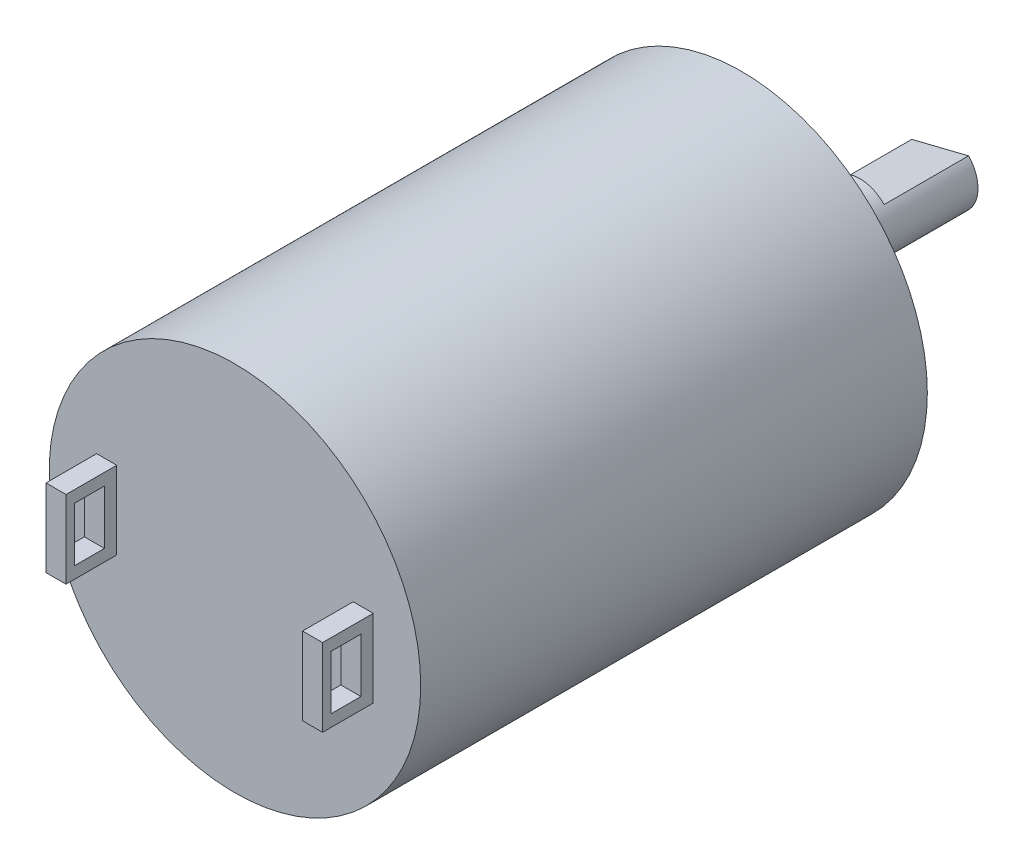
ISO-10303-21;
HEADER;
FILE_DESCRIPTION(('STEP AP214'),'2;1');
FILE_NAME('part.step','',(''),(''),'','','');
FILE_SCHEMA(('AUTOMOTIVE_DESIGN { 1 0 10303 214 1 1 1 1 }'));
ENDSEC;
DATA;
#1=APPLICATION_CONTEXT('core data for automotive mechanical design processes');
#2=APPLICATION_PROTOCOL_DEFINITION('international standard','automotive_design',2000,#1);
#3=PRODUCT_CONTEXT('',#1,'mechanical');
#4=PRODUCT('Part','Part','',(#3));
#5=PRODUCT_RELATED_PRODUCT_CATEGORY('part','',(#4));
#6=PRODUCT_DEFINITION_FORMATION('','',#4);
#7=PRODUCT_DEFINITION_CONTEXT('part definition',#1,'design');
#8=PRODUCT_DEFINITION('design','',#6,#7);
#9=PRODUCT_DEFINITION_SHAPE('','',#8);
#10=(LENGTH_UNIT() NAMED_UNIT(*) SI_UNIT(.MILLI.,.METRE.));
#11=(NAMED_UNIT(*) PLANE_ANGLE_UNIT() SI_UNIT($,.RADIAN.));
#12=(NAMED_UNIT(*) SI_UNIT($,.STERADIAN.) SOLID_ANGLE_UNIT());
#13=UNCERTAINTY_MEASURE_WITH_UNIT(LENGTH_MEASURE(1.E-05),#10,'distance_accuracy_value','');
#14=(GEOMETRIC_REPRESENTATION_CONTEXT(3) GLOBAL_UNCERTAINTY_ASSIGNED_CONTEXT((#13)) GLOBAL_UNIT_ASSIGNED_CONTEXT((#10,
#11,#12)) REPRESENTATION_CONTEXT('',''));
#15=CARTESIAN_POINT('',(0.,0.,0.));
#16=DIRECTION('',(0.,0.,1.));
#17=DIRECTION('',(1.,0.,0.));
#18=AXIS2_PLACEMENT_3D('',#15,#16,#17);
#19=CARTESIAN_POINT('',(0.,0.,30.));
#20=DIRECTION('',(0.,0.,1.));
#21=DIRECTION('',(1.,0.,0.));
#22=AXIS2_PLACEMENT_3D('',#19,#20,#21);
#23=PLANE('',#22);
#24=CARTESIAN_POINT('',(0.,0.,30.));
#25=DIRECTION('',(0.,0.,1.));
#26=DIRECTION('',(1.,0.,0.));
#27=AXIS2_PLACEMENT_3D('',#24,#25,#26);
#28=CIRCLE('',#27,11.);
#29=CARTESIAN_POINT('',(11.,0.,30.));
#30=VERTEX_POINT('',#29);
#31=EDGE_CURVE('E349',#30,#30,#28,.T.);
#32=ORIENTED_EDGE('',*,*,#31,.T.);
#33=EDGE_LOOP('',(#32));
#34=FACE_BOUND('',#33,.T.);
#35=DIRECTION('',(-1.,0.,0.));
#36=VECTOR('',#35,1.);
#37=CARTESIAN_POINT('',(-8.18827936798705,2.30085685288373,30.));
#38=LINE('',#37,#36);
#39=CARTESIAN_POINT('',(-7.00102773342159,2.30085685288373,30.));
#40=VERTEX_POINT('',#39);
#41=CARTESIAN_POINT('',(-8.18827936798705,2.30085685288373,30.));
#42=VERTEX_POINT('',#41);
#43=EDGE_CURVE('E311',#40,#42,#38,.T.);
#44=ORIENTED_EDGE('',*,*,#43,.F.);
#45=DIRECTION('',(0.,1.,0.));
#46=VECTOR('',#45,1.);
#47=CARTESIAN_POINT('',(-7.00102773342159,-2.30085685288373,30.));
#48=LINE('',#47,#46);
#49=CARTESIAN_POINT('',(-7.00102773342159,-2.30085685288373,30.));
#50=VERTEX_POINT('',#49);
#51=EDGE_CURVE('E292',#50,#40,#48,.T.);
#52=ORIENTED_EDGE('',*,*,#51,.F.);
#53=DIRECTION('',(1.,0.,0.));
#54=VECTOR('',#53,1.);
#55=CARTESIAN_POINT('',(-8.18827936798705,-2.30085685288373,30.));
#56=LINE('',#55,#54);
#57=CARTESIAN_POINT('',(-8.18827936798705,-2.30085685288373,30.));
#58=VERTEX_POINT('',#57);
#59=EDGE_CURVE('E298',#58,#50,#56,.T.);
#60=ORIENTED_EDGE('',*,*,#59,.F.);
#61=DIRECTION('',(0.,-1.,0.));
#62=VECTOR('',#61,1.);
#63=CARTESIAN_POINT('',(-8.18827936798705,-2.30085685288373,30.));
#64=LINE('',#63,#62);
#65=EDGE_CURVE('E314',#42,#58,#64,.T.);
#66=ORIENTED_EDGE('',*,*,#65,.F.);
#67=EDGE_LOOP('',(#44,#52,#60,#66));
#68=FACE_BOUND('',#67,.T.);
#69=DIRECTION('',(0.,-1.,0.));
#70=VECTOR('',#69,1.);
#71=CARTESIAN_POINT('',(7.00102773342159,-2.30085685288372,30.));
#72=LINE('',#71,#70);
#73=CARTESIAN_POINT('',(7.00102773342159,2.30085685288372,30.));
#74=VERTEX_POINT('',#73);
#75=CARTESIAN_POINT('',(7.00102773342159,-2.30085685288372,30.));
#76=VERTEX_POINT('',#75);
#77=EDGE_CURVE('E270',#74,#76,#72,.T.);
#78=ORIENTED_EDGE('',*,*,#77,.F.);
#79=DIRECTION('',(-1.,0.,0.));
#80=VECTOR('',#79,1.);
#81=CARTESIAN_POINT('',(8.18827936798705,2.30085685288372,30.));
#82=LINE('',#81,#80);
#83=CARTESIAN_POINT('',(8.18827936798705,2.30085685288372,30.));
#84=VERTEX_POINT('',#83);
#85=EDGE_CURVE('E251',#84,#74,#82,.T.);
#86=ORIENTED_EDGE('',*,*,#85,.F.);
#87=DIRECTION('',(0.,1.,0.));
#88=VECTOR('',#87,1.);
#89=CARTESIAN_POINT('',(8.18827936798705,-2.30085685288372,30.));
#90=LINE('',#89,#88);
#91=CARTESIAN_POINT('',(8.18827936798705,-2.30085685288372,30.));
#92=VERTEX_POINT('',#91);
#93=EDGE_CURVE('E257',#92,#84,#90,.T.);
#94=ORIENTED_EDGE('',*,*,#93,.F.);
#95=DIRECTION('',(1.,0.,0.));
#96=VECTOR('',#95,1.);
#97=CARTESIAN_POINT('',(8.18827936798705,-2.30085685288372,30.));
#98=LINE('',#97,#96);
#99=EDGE_CURVE('E273',#76,#92,#98,.T.);
#100=ORIENTED_EDGE('',*,*,#99,.F.);
#101=EDGE_LOOP('',(#78,#86,#94,#100));
#102=FACE_BOUND('',#101,.T.);
#103=ADVANCED_FACE('F39',(#34,#68,#102),#23,.T.);
#104=CARTESIAN_POINT('',(0.,0.,30.));
#105=DIRECTION('',(0.,0.,-1.));
#106=DIRECTION('',(-1.,0.,0.));
#107=AXIS2_PLACEMENT_3D('',#104,#105,#106);
#108=CYLINDRICAL_SURFACE('',#107,11.);
#109=ORIENTED_EDGE('',*,*,#31,.F.);
#110=EDGE_LOOP('',(#109));
#111=FACE_BOUND('',#110,.T.);
#112=CARTESIAN_POINT('',(0.,0.,0.));
#113=DIRECTION('',(0.,0.,1.));
#114=DIRECTION('',(1.,0.,0.));
#115=AXIS2_PLACEMENT_3D('',#112,#113,#114);
#116=CIRCLE('',#115,11.);
#117=CARTESIAN_POINT('',(11.,0.,0.));
#118=VERTEX_POINT('',#117);
#119=EDGE_CURVE('E345',#118,#118,#116,.T.);
#120=ORIENTED_EDGE('',*,*,#119,.T.);
#121=EDGE_LOOP('',(#120));
#122=FACE_BOUND('',#121,.T.);
#123=ADVANCED_FACE('F41',(#111,#122),#108,.T.);
#124=CARTESIAN_POINT('',(0.,0.,0.));
#125=DIRECTION('',(0.,0.,1.));
#126=DIRECTION('',(1.,0.,0.));
#127=AXIS2_PLACEMENT_3D('',#124,#125,#126);
#128=PLANE('',#127);
#129=CARTESIAN_POINT('',(0.,0.,0.));
#130=DIRECTION('',(0.,0.,-1.));
#131=DIRECTION('',(-1.,0.,0.));
#132=AXIS2_PLACEMENT_3D('',#129,#130,#131);
#133=CIRCLE('',#132,3.);
#134=CARTESIAN_POINT('',(-3.,0.,0.));
#135=VERTEX_POINT('',#134);
#136=EDGE_CURVE('E341',#135,#135,#133,.T.);
#137=ORIENTED_EDGE('',*,*,#136,.F.);
#138=EDGE_LOOP('',(#137));
#139=FACE_BOUND('',#138,.T.);
#140=ORIENTED_EDGE('',*,*,#119,.F.);
#141=EDGE_LOOP('',(#140));
#142=FACE_BOUND('',#141,.T.);
#143=ADVANCED_FACE('F426',(#139,#142),#128,.F.);
#144=CARTESIAN_POINT('',(0.,0.,-2.));
#145=DIRECTION('',(0.,0.,1.));
#146=DIRECTION('',(1.,0.,0.));
#147=AXIS2_PLACEMENT_3D('',#144,#145,#146);
#148=CYLINDRICAL_SURFACE('',#147,3.);
#149=CARTESIAN_POINT('',(0.,0.,-2.));
#150=DIRECTION('',(0.,0.,-1.));
#151=DIRECTION('',(-1.,0.,0.));
#152=AXIS2_PLACEMENT_3D('',#149,#150,#151);
#153=CIRCLE('',#152,3.);
#154=CARTESIAN_POINT('',(-3.,0.,-2.));
#155=VERTEX_POINT('',#154);
#156=EDGE_CURVE('E335',#155,#155,#153,.T.);
#157=ORIENTED_EDGE('',*,*,#156,.F.);
#158=EDGE_LOOP('',(#157));
#159=FACE_BOUND('',#158,.T.);
#160=ORIENTED_EDGE('',*,*,#136,.T.);
#161=EDGE_LOOP('',(#160));
#162=FACE_BOUND('',#161,.T.);
#163=ADVANCED_FACE('F430',(#159,#162),#148,.T.);
#164=CARTESIAN_POINT('',(0.,0.,-2.));
#165=DIRECTION('',(0.,0.,-1.));
#166=DIRECTION('',(-1.,0.,0.));
#167=AXIS2_PLACEMENT_3D('',#164,#165,#166);
#168=PLANE('',#167);
#169=CARTESIAN_POINT('',(0.,0.,-2.));
#170=DIRECTION('',(0.,0.,-1.));
#171=DIRECTION('',(-1.,0.,0.));
#172=AXIS2_PLACEMENT_3D('',#169,#170,#171);
#173=CIRCLE('',#172,2.);
#174=CARTESIAN_POINT('',(-2.,0.,-2.));
#175=VERTEX_POINT('',#174);
#176=EDGE_CURVE('E336',#175,#175,#173,.T.);
#177=ORIENTED_EDGE('',*,*,#176,.F.);
#178=EDGE_LOOP('',(#177));
#179=FACE_BOUND('',#178,.T.);
#180=ORIENTED_EDGE('',*,*,#156,.T.);
#181=EDGE_LOOP('',(#180));
#182=FACE_BOUND('',#181,.T.);
#183=ADVANCED_FACE('F437',(#179,#182),#168,.T.);
#184=CARTESIAN_POINT('',(0.,0.,-12.));
#185=DIRECTION('',(0.,0.,1.));
#186=DIRECTION('',(1.,0.,0.));
#187=AXIS2_PLACEMENT_3D('',#184,#185,#186);
#188=CYLINDRICAL_SURFACE('',#187,2.);
#189=CARTESIAN_POINT('',(0.,0.,-12.));
#190=DIRECTION('',(0.,0.,-1.));
#191=DIRECTION('',(-1.,0.,0.));
#192=AXIS2_PLACEMENT_3D('',#189,#190,#191);
#193=CIRCLE('',#192,2.);
#194=CARTESIAN_POINT('',(1.43985808824735,1.38809534460306,-12.));
#195=VERTEX_POINT('',#194);
#196=CARTESIAN_POINT('',(-1.92205487542484,0.552906009965174,-12.));
#197=VERTEX_POINT('',#196);
#198=EDGE_CURVE('E182',#195,#197,#193,.T.);
#199=ORIENTED_EDGE('',*,*,#198,.F.);
#200=DIRECTION('',(0.,0.,-1.));
#201=VECTOR('',#200,1.);
#202=CARTESIAN_POINT('',(1.43985808824735,1.38809534460306,-7.));
#203=LINE('',#202,#201);
#204=CARTESIAN_POINT('',(1.43985808824735,1.38809534460306,-7.));
#205=VERTEX_POINT('',#204);
#206=EDGE_CURVE('E55',#205,#195,#203,.T.);
#207=ORIENTED_EDGE('',*,*,#206,.F.);
#208=CARTESIAN_POINT('',(0.,0.,-7.));
#209=DIRECTION('',(0.,0.,-1.));
#210=DIRECTION('',(-1.,0.,0.));
#211=AXIS2_PLACEMENT_3D('',#208,#209,#210);
#212=CIRCLE('',#211,2.);
#213=CARTESIAN_POINT('',(-1.92205487542484,0.552906009965174,-7.));
#214=VERTEX_POINT('',#213);
#215=EDGE_CURVE('E166',#214,#205,#212,.T.);
#216=ORIENTED_EDGE('',*,*,#215,.F.);
#217=DIRECTION('',(0.,0.,-1.));
#218=VECTOR('',#217,1.);
#219=CARTESIAN_POINT('',(-1.92205487542484,0.552906009965174,-7.));
#220=LINE('',#219,#218);
#221=EDGE_CURVE('E175',#214,#197,#220,.T.);
#222=ORIENTED_EDGE('',*,*,#221,.T.);
#223=EDGE_LOOP('',(#199,#207,#216,#222));
#224=FACE_BOUND('',#223,.T.);
#225=ORIENTED_EDGE('',*,*,#176,.T.);
#226=EDGE_LOOP('',(#225));
#227=FACE_BOUND('',#226,.T.);
#228=ADVANCED_FACE('F179',(#224,#227),#188,.T.);
#229=CARTESIAN_POINT('',(0.,0.,-12.));
#230=DIRECTION('',(0.,0.,-1.));
#231=DIRECTION('',(-1.,0.,0.));
#232=AXIS2_PLACEMENT_3D('',#229,#230,#231);
#233=PLANE('',#232);
#234=DIRECTION('',(-0.970500677284116,-0.241098393588743,0.));
#235=VECTOR('',#234,1.);
#236=CARTESIAN_POINT('',(-0.241098393588743,0.970500677284116,-12.));
#237=LINE('',#236,#235);
#238=EDGE_CURVE('E172',#195,#197,#237,.T.);
#239=ORIENTED_EDGE('',*,*,#238,.F.);
#240=ORIENTED_EDGE('',*,*,#198,.T.);
#241=EDGE_LOOP('',(#239,#240));
#242=FACE_BOUND('',#241,.T.);
#243=ADVANCED_FACE('F453',(#242),#233,.T.);
#244=CARTESIAN_POINT('',(-7.00102773342159,-2.30085685288373,33.));
#245=DIRECTION('',(-1.,0.,0.));
#246=DIRECTION('',(0.,0.,1.));
#247=AXIS2_PLACEMENT_3D('',#244,#245,#246);
#248=PLANE('',#247);
#249=DIRECTION('',(0.,0.,1.));
#250=VECTOR('',#249,1.);
#251=CARTESIAN_POINT('',(-7.00102773342159,-1.60085685288373,33.));
#252=LINE('',#251,#250);
#253=CARTESIAN_POINT('',(-7.00102773342159,-1.60085685288373,30.7286829134021));
#254=VERTEX_POINT('',#253);
#255=CARTESIAN_POINT('',(-7.00102773342159,-1.60085685288373,32.5));
#256=VERTEX_POINT('',#255);
#257=EDGE_CURVE('E239',#254,#256,#252,.T.);
#258=ORIENTED_EDGE('',*,*,#257,.T.);
#259=DIRECTION('',(0.,1.,0.));
#260=VECTOR('',#259,1.);
#261=CARTESIAN_POINT('',(-7.00102773342159,-2.30085685288373,32.5));
#262=LINE('',#261,#260);
#263=CARTESIAN_POINT('',(-7.00102773342159,1.60085685288373,32.5));
#264=VERTEX_POINT('',#263);
#265=EDGE_CURVE('E247',#256,#264,#262,.T.);
#266=ORIENTED_EDGE('',*,*,#265,.T.);
#267=DIRECTION('',(0.,0.,-1.));
#268=VECTOR('',#267,1.);
#269=CARTESIAN_POINT('',(-7.00102773342159,1.60085685288373,33.));
#270=LINE('',#269,#268);
#271=CARTESIAN_POINT('',(-7.00102773342159,1.60085685288373,30.7286829134021));
#272=VERTEX_POINT('',#271);
#273=EDGE_CURVE('E223',#264,#272,#270,.T.);
#274=ORIENTED_EDGE('',*,*,#273,.T.);
#275=DIRECTION('',(0.,-1.,0.));
#276=VECTOR('',#275,1.);
#277=CARTESIAN_POINT('',(-7.00102773342159,-2.30085685288373,30.7286829134021));
#278=LINE('',#277,#276);
#279=EDGE_CURVE('E231',#272,#254,#278,.T.);
#280=ORIENTED_EDGE('',*,*,#279,.T.);
#281=EDGE_LOOP('',(#258,#266,#274,#280));
#282=FACE_BOUND('',#281,.T.);
#283=ORIENTED_EDGE('',*,*,#51,.T.);
#284=DIRECTION('',(0.,0.,-1.));
#285=VECTOR('',#284,1.);
#286=CARTESIAN_POINT('',(-7.00102773342159,2.30085685288373,33.));
#287=LINE('',#286,#285);
#288=CARTESIAN_POINT('',(-7.00102773342159,2.30085685288373,33.));
#289=VERTEX_POINT('',#288);
#290=EDGE_CURVE('E330',#289,#40,#287,.T.);
#291=ORIENTED_EDGE('',*,*,#290,.F.);
#292=DIRECTION('',(0.,1.,0.));
#293=VECTOR('',#292,1.);
#294=CARTESIAN_POINT('',(-7.00102773342159,-2.30085685288373,33.));
#295=LINE('',#294,#293);
#296=CARTESIAN_POINT('',(-7.00102773342159,-2.30085685288373,33.));
#297=VERTEX_POINT('',#296);
#298=EDGE_CURVE('E293',#297,#289,#295,.T.);
#299=ORIENTED_EDGE('',*,*,#298,.F.);
#300=DIRECTION('',(0.,0.,-1.));
#301=VECTOR('',#300,1.);
#302=CARTESIAN_POINT('',(-7.00102773342159,-2.30085685288373,33.));
#303=LINE('',#302,#301);
#304=EDGE_CURVE('E307',#297,#50,#303,.T.);
#305=ORIENTED_EDGE('',*,*,#304,.T.);
#306=EDGE_LOOP('',(#283,#291,#299,#305));
#307=FACE_BOUND('',#306,.T.);
#308=ADVANCED_FACE('F459',(#282,#307),#248,.F.);
#309=CARTESIAN_POINT('',(-8.18827936798705,2.30085685288373,33.));
#310=DIRECTION('',(0.,-1.,0.));
#311=DIRECTION('',(0.,0.,-1.));
#312=AXIS2_PLACEMENT_3D('',#309,#310,#311);
#313=PLANE('',#312);
#314=ORIENTED_EDGE('',*,*,#43,.T.);
#315=DIRECTION('',(0.,0.,-1.));
#316=VECTOR('',#315,1.);
#317=CARTESIAN_POINT('',(-8.18827936798705,2.30085685288373,33.));
#318=LINE('',#317,#316);
#319=CARTESIAN_POINT('',(-8.18827936798705,2.30085685288373,33.));
#320=VERTEX_POINT('',#319);
#321=EDGE_CURVE('E326',#320,#42,#318,.T.);
#322=ORIENTED_EDGE('',*,*,#321,.F.);
#323=DIRECTION('',(-1.,0.,0.));
#324=VECTOR('',#323,1.);
#325=CARTESIAN_POINT('',(-8.18827936798705,2.30085685288373,33.));
#326=LINE('',#325,#324);
#327=EDGE_CURVE('E297',#289,#320,#326,.T.);
#328=ORIENTED_EDGE('',*,*,#327,.F.);
#329=ORIENTED_EDGE('',*,*,#290,.T.);
#330=EDGE_LOOP('',(#314,#322,#328,#329));
#331=FACE_BOUND('',#330,.T.);
#332=ADVANCED_FACE('F463',(#331),#313,.F.);
#333=CARTESIAN_POINT('',(-8.18827936798705,-2.30085685288373,33.));
#334=DIRECTION('',(1.,0.,0.));
#335=DIRECTION('',(0.,0.,-1.));
#336=AXIS2_PLACEMENT_3D('',#333,#334,#335);
#337=PLANE('',#336);
#338=DIRECTION('',(0.,0.,-1.));
#339=VECTOR('',#338,1.);
#340=CARTESIAN_POINT('',(-8.18827936798705,1.60085685288373,30.7286829134021));
#341=LINE('',#340,#339);
#342=CARTESIAN_POINT('',(-8.18827936798705,1.60085685288373,32.5));
#343=VERTEX_POINT('',#342);
#344=CARTESIAN_POINT('',(-8.18827936798705,1.60085685288373,30.7286829134021));
#345=VERTEX_POINT('',#344);
#346=EDGE_CURVE('E192',#343,#345,#341,.T.);
#347=ORIENTED_EDGE('',*,*,#346,.F.);
#348=DIRECTION('',(0.,1.,0.));
#349=VECTOR('',#348,1.);
#350=CARTESIAN_POINT('',(-8.18827936798705,1.60085685288373,32.5));
#351=LINE('',#350,#349);
#352=CARTESIAN_POINT('',(-8.18827936798705,-1.60085685288373,32.5));
#353=VERTEX_POINT('',#352);
#354=EDGE_CURVE('E186',#353,#343,#351,.T.);
#355=ORIENTED_EDGE('',*,*,#354,.F.);
#356=DIRECTION('',(0.,0.,1.));
#357=VECTOR('',#356,1.);
#358=CARTESIAN_POINT('',(-8.18827936798705,-1.60085685288373,30.7286829134021));
#359=LINE('',#358,#357);
#360=CARTESIAN_POINT('',(-8.18827936798705,-1.60085685288373,30.7286829134021));
#361=VERTEX_POINT('',#360);
#362=EDGE_CURVE('E199',#361,#353,#359,.T.);
#363=ORIENTED_EDGE('',*,*,#362,.F.);
#364=DIRECTION('',(0.,-1.,0.));
#365=VECTOR('',#364,1.);
#366=CARTESIAN_POINT('',(-8.18827936798705,1.60085685288373,30.7286829134021));
#367=LINE('',#366,#365);
#368=EDGE_CURVE('E195',#345,#361,#367,.T.);
#369=ORIENTED_EDGE('',*,*,#368,.F.);
#370=EDGE_LOOP('',(#347,#355,#363,#369));
#371=FACE_BOUND('',#370,.T.);
#372=ORIENTED_EDGE('',*,*,#65,.T.);
#373=DIRECTION('',(0.,0.,-1.));
#374=VECTOR('',#373,1.);
#375=CARTESIAN_POINT('',(-8.18827936798705,-2.30085685288373,33.));
#376=LINE('',#375,#374);
#377=CARTESIAN_POINT('',(-8.18827936798705,-2.30085685288373,33.));
#378=VERTEX_POINT('',#377);
#379=EDGE_CURVE('E323',#378,#58,#376,.T.);
#380=ORIENTED_EDGE('',*,*,#379,.F.);
#381=DIRECTION('',(0.,-1.,0.));
#382=VECTOR('',#381,1.);
#383=CARTESIAN_POINT('',(-8.18827936798705,-2.30085685288373,33.));
#384=LINE('',#383,#382);
#385=EDGE_CURVE('E301',#320,#378,#384,.T.);
#386=ORIENTED_EDGE('',*,*,#385,.F.);
#387=ORIENTED_EDGE('',*,*,#321,.T.);
#388=EDGE_LOOP('',(#372,#380,#386,#387));
#389=FACE_BOUND('',#388,.T.);
#390=ADVANCED_FACE('F467',(#371,#389),#337,.F.);
#391=CARTESIAN_POINT('',(-8.18827936798705,-2.30085685288373,33.));
#392=DIRECTION('',(0.,1.,0.));
#393=DIRECTION('',(0.,0.,1.));
#394=AXIS2_PLACEMENT_3D('',#391,#392,#393);
#395=PLANE('',#394);
#396=ORIENTED_EDGE('',*,*,#59,.T.);
#397=ORIENTED_EDGE('',*,*,#304,.F.);
#398=DIRECTION('',(1.,0.,0.));
#399=VECTOR('',#398,1.);
#400=CARTESIAN_POINT('',(-8.18827936798705,-2.30085685288373,33.));
#401=LINE('',#400,#399);
#402=EDGE_CURVE('E304',#378,#297,#401,.T.);
#403=ORIENTED_EDGE('',*,*,#402,.F.);
#404=ORIENTED_EDGE('',*,*,#379,.T.);
#405=EDGE_LOOP('',(#396,#397,#403,#404));
#406=FACE_BOUND('',#405,.T.);
#407=ADVANCED_FACE('F471',(#406),#395,.F.);
#408=CARTESIAN_POINT('',(0.,0.,33.));
#409=DIRECTION('',(0.,0.,-1.));
#410=DIRECTION('',(-1.,0.,0.));
#411=AXIS2_PLACEMENT_3D('',#408,#409,#410);
#412=PLANE('',#411);
#413=ORIENTED_EDGE('',*,*,#298,.T.);
#414=ORIENTED_EDGE('',*,*,#327,.T.);
#415=ORIENTED_EDGE('',*,*,#385,.T.);
#416=ORIENTED_EDGE('',*,*,#402,.T.);
#417=EDGE_LOOP('',(#413,#414,#415,#416));
#418=FACE_BOUND('',#417,.T.);
#419=ADVANCED_FACE('F475',(#418),#412,.F.);
#420=CARTESIAN_POINT('',(8.18827936798705,2.30085685288372,33.));
#421=DIRECTION('',(0.,-1.,0.));
#422=DIRECTION('',(0.,0.,-1.));
#423=AXIS2_PLACEMENT_3D('',#420,#421,#422);
#424=PLANE('',#423);
#425=ORIENTED_EDGE('',*,*,#85,.T.);
#426=DIRECTION('',(0.,0.,-1.));
#427=VECTOR('',#426,1.);
#428=CARTESIAN_POINT('',(7.00102773342159,2.30085685288372,33.));
#429=LINE('',#428,#427);
#430=CARTESIAN_POINT('',(7.00102773342159,2.30085685288372,33.));
#431=VERTEX_POINT('',#430);
#432=EDGE_CURVE('E289',#431,#74,#429,.T.);
#433=ORIENTED_EDGE('',*,*,#432,.F.);
#434=DIRECTION('',(-1.,0.,0.));
#435=VECTOR('',#434,1.);
#436=CARTESIAN_POINT('',(8.18827936798705,2.30085685288372,33.));
#437=LINE('',#436,#435);
#438=CARTESIAN_POINT('',(8.18827936798705,2.30085685288372,33.));
#439=VERTEX_POINT('',#438);
#440=EDGE_CURVE('E252',#439,#431,#437,.T.);
#441=ORIENTED_EDGE('',*,*,#440,.F.);
#442=DIRECTION('',(0.,0.,-1.));
#443=VECTOR('',#442,1.);
#444=CARTESIAN_POINT('',(8.18827936798705,2.30085685288372,33.));
#445=LINE('',#444,#443);
#446=EDGE_CURVE('E266',#439,#84,#445,.T.);
#447=ORIENTED_EDGE('',*,*,#446,.T.);
#448=EDGE_LOOP('',(#425,#433,#441,#447));
#449=FACE_BOUND('',#448,.T.);
#450=ADVANCED_FACE('F392',(#449),#424,.F.);
#451=CARTESIAN_POINT('',(7.00102773342159,-2.30085685288372,33.));
#452=DIRECTION('',(1.,0.,0.));
#453=DIRECTION('',(0.,0.,-1.));
#454=AXIS2_PLACEMENT_3D('',#451,#452,#453);
#455=PLANE('',#454);
#456=DIRECTION('',(0.,0.,1.));
#457=VECTOR('',#456,1.);
#458=CARTESIAN_POINT('',(7.00102773342159,1.60085685288373,33.));
#459=LINE('',#458,#457);
#460=CARTESIAN_POINT('',(7.00102773342159,1.60085685288373,30.7286829134021));
#461=VERTEX_POINT('',#460);
#462=CARTESIAN_POINT('',(7.00102773342159,1.60085685288373,32.5));
#463=VERTEX_POINT('',#462);
#464=EDGE_CURVE('E219',#461,#463,#459,.T.);
#465=ORIENTED_EDGE('',*,*,#464,.T.);
#466=DIRECTION('',(0.,-1.,0.));
#467=VECTOR('',#466,1.);
#468=CARTESIAN_POINT('',(7.00102773342159,-2.30085685288372,32.5));
#469=LINE('',#468,#467);
#470=CARTESIAN_POINT('',(7.00102773342159,-1.60085685288373,32.5));
#471=VERTEX_POINT('',#470);
#472=EDGE_CURVE('E243',#463,#471,#469,.T.);
#473=ORIENTED_EDGE('',*,*,#472,.T.);
#474=DIRECTION('',(0.,0.,-1.));
#475=VECTOR('',#474,1.);
#476=CARTESIAN_POINT('',(7.00102773342159,-1.60085685288373,33.));
#477=LINE('',#476,#475);
#478=CARTESIAN_POINT('',(7.00102773342159,-1.60085685288373,30.7286829134021));
#479=VERTEX_POINT('',#478);
#480=EDGE_CURVE('E235',#471,#479,#477,.T.);
#481=ORIENTED_EDGE('',*,*,#480,.T.);
#482=DIRECTION('',(0.,1.,0.));
#483=VECTOR('',#482,1.);
#484=CARTESIAN_POINT('',(7.00102773342159,-2.30085685288372,30.7286829134021));
#485=LINE('',#484,#483);
#486=EDGE_CURVE('E227',#479,#461,#485,.T.);
#487=ORIENTED_EDGE('',*,*,#486,.T.);
#488=EDGE_LOOP('',(#465,#473,#481,#487));
#489=FACE_BOUND('',#488,.T.);
#490=ORIENTED_EDGE('',*,*,#77,.T.);
#491=DIRECTION('',(0.,0.,-1.));
#492=VECTOR('',#491,1.);
#493=CARTESIAN_POINT('',(7.00102773342159,-2.30085685288372,33.));
#494=LINE('',#493,#492);
#495=CARTESIAN_POINT('',(7.00102773342159,-2.30085685288372,33.));
#496=VERTEX_POINT('',#495);
#497=EDGE_CURVE('E285',#496,#76,#494,.T.);
#498=ORIENTED_EDGE('',*,*,#497,.F.);
#499=DIRECTION('',(0.,-1.,0.));
#500=VECTOR('',#499,1.);
#501=CARTESIAN_POINT('',(7.00102773342159,-2.30085685288372,33.));
#502=LINE('',#501,#500);
#503=EDGE_CURVE('E256',#431,#496,#502,.T.);
#504=ORIENTED_EDGE('',*,*,#503,.F.);
#505=ORIENTED_EDGE('',*,*,#432,.T.);
#506=EDGE_LOOP('',(#490,#498,#504,#505));
#507=FACE_BOUND('',#506,.T.);
#508=ADVANCED_FACE('F388',(#489,#507),#455,.F.);
#509=CARTESIAN_POINT('',(8.18827936798705,-2.30085685288372,33.));
#510=DIRECTION('',(0.,1.,0.));
#511=DIRECTION('',(0.,0.,1.));
#512=AXIS2_PLACEMENT_3D('',#509,#510,#511);
#513=PLANE('',#512);
#514=ORIENTED_EDGE('',*,*,#99,.T.);
#515=DIRECTION('',(0.,0.,-1.));
#516=VECTOR('',#515,1.);
#517=CARTESIAN_POINT('',(8.18827936798705,-2.30085685288372,33.));
#518=LINE('',#517,#516);
#519=CARTESIAN_POINT('',(8.18827936798705,-2.30085685288372,33.));
#520=VERTEX_POINT('',#519);
#521=EDGE_CURVE('E282',#520,#92,#518,.T.);
#522=ORIENTED_EDGE('',*,*,#521,.F.);
#523=DIRECTION('',(1.,0.,0.));
#524=VECTOR('',#523,1.);
#525=CARTESIAN_POINT('',(8.18827936798705,-2.30085685288372,33.));
#526=LINE('',#525,#524);
#527=EDGE_CURVE('E260',#496,#520,#526,.T.);
#528=ORIENTED_EDGE('',*,*,#527,.F.);
#529=ORIENTED_EDGE('',*,*,#497,.T.);
#530=EDGE_LOOP('',(#514,#522,#528,#529));
#531=FACE_BOUND('',#530,.T.);
#532=ADVANCED_FACE('F391',(#531),#513,.F.);
#533=CARTESIAN_POINT('',(8.18827936798705,-2.30085685288372,33.));
#534=DIRECTION('',(-1.,0.,0.));
#535=DIRECTION('',(0.,0.,1.));
#536=AXIS2_PLACEMENT_3D('',#533,#534,#535);
#537=PLANE('',#536);
#538=DIRECTION('',(0.,0.,1.));
#539=VECTOR('',#538,1.);
#540=CARTESIAN_POINT('',(8.18827936798705,-1.60085685288373,33.));
#541=LINE('',#540,#539);
#542=CARTESIAN_POINT('',(8.18827936798705,-1.60085685288373,30.7286829134021));
#543=VERTEX_POINT('',#542);
#544=CARTESIAN_POINT('',(8.18827936798705,-1.60085685288373,32.5));
#545=VERTEX_POINT('',#544);
#546=EDGE_CURVE('E48',#543,#545,#541,.T.);
#547=ORIENTED_EDGE('',*,*,#546,.T.);
#548=DIRECTION('',(0.,1.,0.));
#549=VECTOR('',#548,1.);
#550=CARTESIAN_POINT('',(8.18827936798705,-2.30085685288372,32.5));
#551=LINE('',#550,#549);
#552=CARTESIAN_POINT('',(8.18827936798705,1.60085685288373,32.5));
#553=VERTEX_POINT('',#552);
#554=EDGE_CURVE('E11',#545,#553,#551,.T.);
#555=ORIENTED_EDGE('',*,*,#554,.T.);
#556=DIRECTION('',(0.,0.,-1.));
#557=VECTOR('',#556,1.);
#558=CARTESIAN_POINT('',(8.18827936798705,1.60085685288373,33.));
#559=LINE('',#558,#557);
#560=CARTESIAN_POINT('',(8.18827936798705,1.60085685288373,30.7286829134021));
#561=VERTEX_POINT('',#560);
#562=EDGE_CURVE('E340',#553,#561,#559,.T.);
#563=ORIENTED_EDGE('',*,*,#562,.T.);
#564=DIRECTION('',(0.,-1.,0.));
#565=VECTOR('',#564,1.);
#566=CARTESIAN_POINT('',(8.18827936798705,-2.30085685288372,30.7286829134021));
#567=LINE('',#566,#565);
#568=EDGE_CURVE('E359',#561,#543,#567,.T.);
#569=ORIENTED_EDGE('',*,*,#568,.T.);
#570=EDGE_LOOP('',(#547,#555,#563,#569));
#571=FACE_BOUND('',#570,.T.);
#572=ORIENTED_EDGE('',*,*,#93,.T.);
#573=ORIENTED_EDGE('',*,*,#446,.F.);
#574=DIRECTION('',(0.,1.,0.));
#575=VECTOR('',#574,1.);
#576=CARTESIAN_POINT('',(8.18827936798705,-2.30085685288372,33.));
#577=LINE('',#576,#575);
#578=EDGE_CURVE('E263',#520,#439,#577,.T.);
#579=ORIENTED_EDGE('',*,*,#578,.F.);
#580=ORIENTED_EDGE('',*,*,#521,.T.);
#581=EDGE_LOOP('',(#572,#573,#579,#580));
#582=FACE_BOUND('',#581,.T.);
#583=ADVANCED_FACE('F365',(#571,#582),#537,.F.);
#584=CARTESIAN_POINT('',(0.,0.,33.));
#585=DIRECTION('',(0.,0.,-1.));
#586=DIRECTION('',(-1.,0.,0.));
#587=AXIS2_PLACEMENT_3D('',#584,#585,#586);
#588=PLANE('',#587);
#589=ORIENTED_EDGE('',*,*,#440,.T.);
#590=ORIENTED_EDGE('',*,*,#503,.T.);
#591=ORIENTED_EDGE('',*,*,#527,.T.);
#592=ORIENTED_EDGE('',*,*,#578,.T.);
#593=EDGE_LOOP('',(#589,#590,#591,#592));
#594=FACE_BOUND('',#593,.T.);
#595=ADVANCED_FACE('F409',(#594),#588,.F.);
#596=CARTESIAN_POINT('',(11.,1.60085685288373,30.7286829134021));
#597=DIRECTION('',(0.,1.,0.));
#598=DIRECTION('',(0.,0.,1.));
#599=AXIS2_PLACEMENT_3D('',#596,#597,#598);
#600=PLANE('',#599);
#601=DIRECTION('',(-1.,0.,0.));
#602=VECTOR('',#601,1.);
#603=CARTESIAN_POINT('',(11.,1.60085685288373,30.7286829134021));
#604=LINE('',#603,#602);
#605=EDGE_CURVE('E212',#561,#461,#604,.T.);
#606=ORIENTED_EDGE('',*,*,#605,.F.);
#607=ORIENTED_EDGE('',*,*,#562,.F.);
#608=DIRECTION('',(-1.,0.,0.));
#609=VECTOR('',#608,1.);
#610=CARTESIAN_POINT('',(11.,1.60085685288373,32.5));
#611=LINE('',#610,#609);
#612=EDGE_CURVE('E215',#553,#463,#611,.T.);
#613=ORIENTED_EDGE('',*,*,#612,.T.);
#614=ORIENTED_EDGE('',*,*,#464,.F.);
#615=EDGE_LOOP('',(#606,#607,#613,#614));
#616=FACE_BOUND('',#615,.T.);
#617=ADVANCED_FACE('F384',(#616),#600,.F.);
#618=CARTESIAN_POINT('',(11.,1.60085685288373,30.7286829134021));
#619=DIRECTION('',(0.,0.,-1.));
#620=DIRECTION('',(-1.,0.,0.));
#621=AXIS2_PLACEMENT_3D('',#618,#619,#620);
#622=PLANE('',#621);
#623=DIRECTION('',(-1.,0.,0.));
#624=VECTOR('',#623,1.);
#625=CARTESIAN_POINT('',(11.,-1.60085685288373,30.7286829134021));
#626=LINE('',#625,#624);
#627=EDGE_CURVE('E208',#543,#479,#626,.T.);
#628=ORIENTED_EDGE('',*,*,#627,.F.);
#629=ORIENTED_EDGE('',*,*,#568,.F.);
#630=ORIENTED_EDGE('',*,*,#605,.T.);
#631=ORIENTED_EDGE('',*,*,#486,.F.);
#632=EDGE_LOOP('',(#628,#629,#630,#631));
#633=FACE_BOUND('',#632,.T.);
#634=ADVANCED_FACE('F375',(#633),#622,.F.);
#635=CARTESIAN_POINT('',(11.,-1.60085685288373,30.7286829134021));
#636=DIRECTION('',(0.,-1.,0.));
#637=DIRECTION('',(0.,0.,-1.));
#638=AXIS2_PLACEMENT_3D('',#635,#636,#637);
#639=PLANE('',#638);
#640=DIRECTION('',(-1.,0.,0.));
#641=VECTOR('',#640,1.);
#642=CARTESIAN_POINT('',(11.,-1.60085685288373,32.5));
#643=LINE('',#642,#641);
#644=EDGE_CURVE('E207',#545,#471,#643,.T.);
#645=ORIENTED_EDGE('',*,*,#644,.F.);
#646=ORIENTED_EDGE('',*,*,#546,.F.);
#647=ORIENTED_EDGE('',*,*,#627,.T.);
#648=ORIENTED_EDGE('',*,*,#480,.F.);
#649=EDGE_LOOP('',(#645,#646,#647,#648));
#650=FACE_BOUND('',#649,.T.);
#651=ADVANCED_FACE('F372',(#650),#639,.F.);
#652=CARTESIAN_POINT('',(11.,1.60085685288373,32.5));
#653=DIRECTION('',(0.,0.,1.));
#654=DIRECTION('',(1.,0.,0.));
#655=AXIS2_PLACEMENT_3D('',#652,#653,#654);
#656=PLANE('',#655);
#657=ORIENTED_EDGE('',*,*,#612,.F.);
#658=ORIENTED_EDGE('',*,*,#554,.F.);
#659=ORIENTED_EDGE('',*,*,#644,.T.);
#660=ORIENTED_EDGE('',*,*,#472,.F.);
#661=EDGE_LOOP('',(#657,#658,#659,#660));
#662=FACE_BOUND('',#661,.T.);
#663=ADVANCED_FACE('F386',(#662),#656,.F.);
#664=EDGE_CURVE('E204',#256,#353,#643,.T.);
#665=ORIENTED_EDGE('',*,*,#664,.T.);
#666=ORIENTED_EDGE('',*,*,#354,.T.);
#667=EDGE_CURVE('E203',#264,#343,#611,.T.);
#668=ORIENTED_EDGE('',*,*,#667,.F.);
#669=ORIENTED_EDGE('',*,*,#265,.F.);
#670=EDGE_LOOP('',(#665,#666,#668,#669));
#671=FACE_BOUND('',#670,.T.);
#672=ADVANCED_FACE('F529',(#671),#656,.F.);
#673=EDGE_CURVE('E209',#254,#361,#626,.T.);
#674=ORIENTED_EDGE('',*,*,#673,.T.);
#675=ORIENTED_EDGE('',*,*,#362,.T.);
#676=ORIENTED_EDGE('',*,*,#664,.F.);
#677=ORIENTED_EDGE('',*,*,#257,.F.);
#678=EDGE_LOOP('',(#674,#675,#676,#677));
#679=FACE_BOUND('',#678,.T.);
#680=ADVANCED_FACE('F521',(#679),#639,.F.);
#681=EDGE_CURVE('E63',#272,#345,#604,.T.);
#682=ORIENTED_EDGE('',*,*,#681,.T.);
#683=ORIENTED_EDGE('',*,*,#368,.T.);
#684=ORIENTED_EDGE('',*,*,#673,.F.);
#685=ORIENTED_EDGE('',*,*,#279,.F.);
#686=EDGE_LOOP('',(#682,#683,#684,#685));
#687=FACE_BOUND('',#686,.T.);
#688=ADVANCED_FACE('F512',(#687),#622,.F.);
#689=ORIENTED_EDGE('',*,*,#667,.T.);
#690=ORIENTED_EDGE('',*,*,#346,.T.);
#691=ORIENTED_EDGE('',*,*,#681,.F.);
#692=ORIENTED_EDGE('',*,*,#273,.F.);
#693=EDGE_LOOP('',(#689,#690,#691,#692));
#694=FACE_BOUND('',#693,.T.);
#695=ADVANCED_FACE('F417',(#694),#600,.F.);
#696=CARTESIAN_POINT('',(-0.241098393588743,0.970500677284116,-7.));
#697=DIRECTION('',(0.241098393588743,-0.970500677284116,0.));
#698=DIRECTION('',(0.970500677284116,0.241098393588743,0.));
#699=AXIS2_PLACEMENT_3D('',#696,#697,#698);
#700=PLANE('',#699);
#701=ORIENTED_EDGE('',*,*,#238,.T.);
#702=ORIENTED_EDGE('',*,*,#221,.F.);
#703=DIRECTION('',(-0.970500677284116,-0.241098393588743,0.));
#704=VECTOR('',#703,1.);
#705=CARTESIAN_POINT('',(-0.241098393588743,0.970500677284116,-7.));
#706=LINE('',#705,#704);
#707=EDGE_CURVE('E168',#205,#214,#706,.T.);
#708=ORIENTED_EDGE('',*,*,#707,.F.);
#709=ORIENTED_EDGE('',*,*,#206,.T.);
#710=EDGE_LOOP('',(#701,#702,#708,#709));
#711=FACE_BOUND('',#710,.T.);
#712=ADVANCED_FACE('F174',(#711),#700,.F.);
#713=CARTESIAN_POINT('',(0.,0.,-7.));
#714=DIRECTION('',(0.,0.,-1.));
#715=DIRECTION('',(-1.,0.,0.));
#716=AXIS2_PLACEMENT_3D('',#713,#714,#715);
#717=PLANE('',#716);
#718=ORIENTED_EDGE('',*,*,#215,.T.);
#719=ORIENTED_EDGE('',*,*,#707,.T.);
#720=EDGE_LOOP('',(#718,#719));
#721=FACE_BOUND('',#720,.T.);
#722=ADVANCED_FACE('F167',(#721),#717,.T.);
#723=CLOSED_SHELL('',(#103,#123,#143,#163,#183,#228,#243,#308,#332,#390,#407,#419,#450,#508,
#532,#583,#595,#617,#634,#651,#663,#672,#680,#688,#695,#712,#722));
#724=MANIFOLD_SOLID_BREP('B2',#723);
#725=ADVANCED_BREP_SHAPE_REPRESENTATION('',(#18,#724),#14);
#726=SHAPE_DEFINITION_REPRESENTATION(#9,#725);
ENDSEC;
END-ISO-10303-21;
